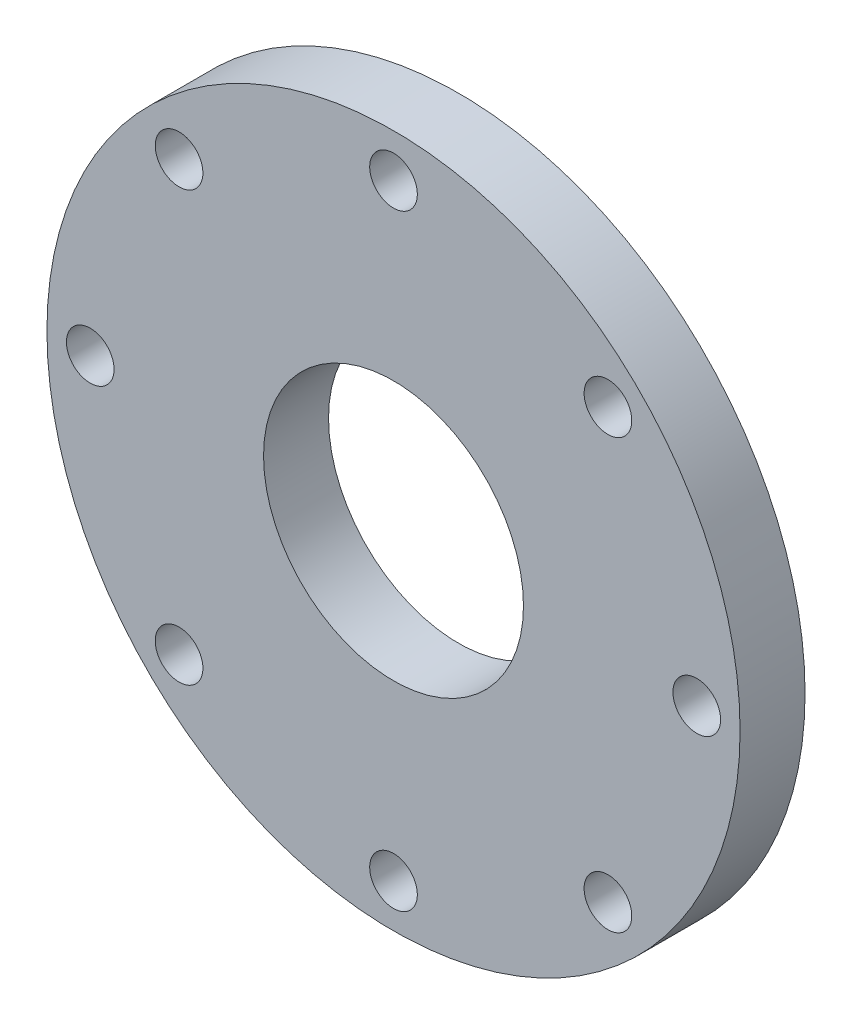
ISO-10303-21;
HEADER;
FILE_DESCRIPTION(('STEP AP214'),'2;1');
FILE_NAME('part.step','',(''),(''),'','','');
FILE_SCHEMA(('AUTOMOTIVE_DESIGN { 1 0 10303 214 1 1 1 1 }'));
ENDSEC;
DATA;
#1=APPLICATION_CONTEXT('core data for automotive mechanical design processes');
#2=APPLICATION_PROTOCOL_DEFINITION('international standard','automotive_design',2000,#1);
#3=PRODUCT_CONTEXT('',#1,'mechanical');
#4=PRODUCT('Part','Part','',(#3));
#5=PRODUCT_RELATED_PRODUCT_CATEGORY('part','',(#4));
#6=PRODUCT_DEFINITION_FORMATION('','',#4);
#7=PRODUCT_DEFINITION_CONTEXT('part definition',#1,'design');
#8=PRODUCT_DEFINITION('design','',#6,#7);
#9=PRODUCT_DEFINITION_SHAPE('','',#8);
#10=(LENGTH_UNIT() NAMED_UNIT(*) SI_UNIT(.MILLI.,.METRE.));
#11=(NAMED_UNIT(*) PLANE_ANGLE_UNIT() SI_UNIT($,.RADIAN.));
#12=(NAMED_UNIT(*) SI_UNIT($,.STERADIAN.) SOLID_ANGLE_UNIT());
#13=UNCERTAINTY_MEASURE_WITH_UNIT(LENGTH_MEASURE(1.E-05),#10,'distance_accuracy_value','');
#14=(GEOMETRIC_REPRESENTATION_CONTEXT(3) GLOBAL_UNCERTAINTY_ASSIGNED_CONTEXT((#13)) GLOBAL_UNIT_ASSIGNED_CONTEXT((#10,
#11,#12)) REPRESENTATION_CONTEXT('',''));
#15=CARTESIAN_POINT('',(0.,0.,0.));
#16=DIRECTION('',(0.,0.,1.));
#17=DIRECTION('',(1.,0.,0.));
#18=AXIS2_PLACEMENT_3D('',#15,#16,#17);
#19=CARTESIAN_POINT('',(49.497474683058,49.497474683058,0.));
#20=DIRECTION('',(0.,0.,-1.));
#21=DIRECTION('',(0.707106781186548,0.707106781186548,0.));
#22=AXIS2_PLACEMENT_3D('',#19,#20,#21);
#23=CYLINDRICAL_SURFACE('',#22,5.5);
#24=DIRECTION('',(0.,0.,1.));
#25=VECTOR('',#24,1.);
#26=CARTESIAN_POINT('',(53.386561979584,53.386561979584,0.));
#27=LINE('',#26,#25);
#28=CARTESIAN_POINT('',(53.386561979584,53.386561979584,0.));
#29=VERTEX_POINT('',#28);
#30=CARTESIAN_POINT('',(53.386561979584,53.386561979584,15.));
#31=VERTEX_POINT('',#30);
#32=EDGE_CURVE('E10',#29,#31,#27,.T.);
#33=ORIENTED_EDGE('',*,*,#32,.F.);
#34=CARTESIAN_POINT('',(49.497474683058,49.497474683058,0.));
#35=DIRECTION('',(0.,0.,1.));
#36=DIRECTION('',(0.707106781186548,0.707106781186548,0.));
#37=AXIS2_PLACEMENT_3D('',#34,#35,#36);
#38=CIRCLE('',#37,5.5);
#39=EDGE_CURVE('E199',#29,#29,#38,.T.);
#40=ORIENTED_EDGE('',*,*,#39,.F.);
#41=ORIENTED_EDGE('',*,*,#32,.T.);
#42=CARTESIAN_POINT('',(49.497474683058,49.497474683058,15.));
#43=DIRECTION('',(0.,0.,-1.));
#44=DIRECTION('',(0.707106781186548,0.707106781186548,0.));
#45=AXIS2_PLACEMENT_3D('',#42,#43,#44);
#46=CIRCLE('',#45,5.5);
#47=EDGE_CURVE('E182',#31,#31,#46,.T.);
#48=ORIENTED_EDGE('',*,*,#47,.F.);
#49=EDGE_LOOP('',(#33,#40,#41,#48));
#50=FACE_BOUND('',#49,.T.);
#51=ADVANCED_FACE('F16',(#50),#23,.F.);
#52=CARTESIAN_POINT('',(0.,70.,0.));
#53=DIRECTION('',(0.,0.,-1.));
#54=DIRECTION('',(0.,1.,0.));
#55=AXIS2_PLACEMENT_3D('',#52,#53,#54);
#56=CYLINDRICAL_SURFACE('',#55,5.5);
#57=DIRECTION('',(0.,0.,1.));
#58=VECTOR('',#57,1.);
#59=CARTESIAN_POINT('',(0.,75.5,0.));
#60=LINE('',#59,#58);
#61=CARTESIAN_POINT('',(0.,75.5,0.));
#62=VERTEX_POINT('',#61);
#63=CARTESIAN_POINT('',(0.,75.5,15.));
#64=VERTEX_POINT('',#63);
#65=EDGE_CURVE('E25',#62,#64,#60,.T.);
#66=ORIENTED_EDGE('',*,*,#65,.F.);
#67=CARTESIAN_POINT('',(0.,70.,0.));
#68=DIRECTION('',(0.,0.,1.));
#69=DIRECTION('',(0.,1.,0.));
#70=AXIS2_PLACEMENT_3D('',#67,#68,#69);
#71=CIRCLE('',#70,5.5);
#72=EDGE_CURVE('E212',#62,#62,#71,.T.);
#73=ORIENTED_EDGE('',*,*,#72,.F.);
#74=ORIENTED_EDGE('',*,*,#65,.T.);
#75=CARTESIAN_POINT('',(0.,70.,15.));
#76=DIRECTION('',(0.,0.,-1.));
#77=DIRECTION('',(0.,1.,0.));
#78=AXIS2_PLACEMENT_3D('',#75,#76,#77);
#79=CIRCLE('',#78,5.5);
#80=EDGE_CURVE('E162',#64,#64,#79,.T.);
#81=ORIENTED_EDGE('',*,*,#80,.F.);
#82=EDGE_LOOP('',(#66,#73,#74,#81));
#83=FACE_BOUND('',#82,.T.);
#84=ADVANCED_FACE('F231',(#83),#56,.F.);
#85=CARTESIAN_POINT('',(70.,0.,0.));
#86=DIRECTION('',(0.,0.,-1.));
#87=DIRECTION('',(1.,0.,0.));
#88=AXIS2_PLACEMENT_3D('',#85,#86,#87);
#89=CYLINDRICAL_SURFACE('',#88,5.5);
#90=DIRECTION('',(0.,0.,1.));
#91=VECTOR('',#90,1.);
#92=CARTESIAN_POINT('',(75.5,0.,0.));
#93=LINE('',#92,#91);
#94=CARTESIAN_POINT('',(75.5,0.,0.));
#95=VERTEX_POINT('',#94);
#96=CARTESIAN_POINT('',(75.5,0.,15.));
#97=VERTEX_POINT('',#96);
#98=EDGE_CURVE('E227',#95,#97,#93,.T.);
#99=ORIENTED_EDGE('',*,*,#98,.F.);
#100=CARTESIAN_POINT('',(70.,0.,0.));
#101=DIRECTION('',(0.,0.,1.));
#102=DIRECTION('',(1.,0.,0.));
#103=AXIS2_PLACEMENT_3D('',#100,#101,#102);
#104=CIRCLE('',#103,5.5);
#105=EDGE_CURVE('E198',#95,#95,#104,.T.);
#106=ORIENTED_EDGE('',*,*,#105,.F.);
#107=ORIENTED_EDGE('',*,*,#98,.T.);
#108=CARTESIAN_POINT('',(70.,0.,15.));
#109=DIRECTION('',(0.,0.,-1.));
#110=DIRECTION('',(1.,0.,0.));
#111=AXIS2_PLACEMENT_3D('',#108,#109,#110);
#112=CIRCLE('',#111,5.5);
#113=EDGE_CURVE('E158',#97,#97,#112,.T.);
#114=ORIENTED_EDGE('',*,*,#113,.F.);
#115=EDGE_LOOP('',(#99,#106,#107,#114));
#116=FACE_BOUND('',#115,.T.);
#117=ADVANCED_FACE('F277',(#116),#89,.F.);
#118=CARTESIAN_POINT('',(0.,0.,0.));
#119=DIRECTION('',(0.,0.,-1.));
#120=DIRECTION('',(1.,0.,0.));
#121=AXIS2_PLACEMENT_3D('',#118,#119,#120);
#122=CYLINDRICAL_SURFACE('',#121,30.);
#123=DIRECTION('',(0.,0.,1.));
#124=VECTOR('',#123,1.);
#125=CARTESIAN_POINT('',(30.,0.,0.));
#126=LINE('',#125,#124);
#127=CARTESIAN_POINT('',(30.,0.,0.));
#128=VERTEX_POINT('',#127);
#129=CARTESIAN_POINT('',(30.,0.,15.));
#130=VERTEX_POINT('',#129);
#131=EDGE_CURVE('E107',#128,#130,#126,.T.);
#132=ORIENTED_EDGE('',*,*,#131,.F.);
#133=CARTESIAN_POINT('',(0.,0.,0.));
#134=DIRECTION('',(0.,0.,1.));
#135=DIRECTION('',(1.,0.,0.));
#136=AXIS2_PLACEMENT_3D('',#133,#134,#135);
#137=CIRCLE('',#136,30.);
#138=EDGE_CURVE('E202',#128,#128,#137,.T.);
#139=ORIENTED_EDGE('',*,*,#138,.F.);
#140=ORIENTED_EDGE('',*,*,#131,.T.);
#141=CARTESIAN_POINT('',(0.,0.,15.));
#142=DIRECTION('',(0.,0.,-1.));
#143=DIRECTION('',(1.,0.,0.));
#144=AXIS2_PLACEMENT_3D('',#141,#142,#143);
#145=CIRCLE('',#144,30.);
#146=EDGE_CURVE('E163',#130,#130,#145,.T.);
#147=ORIENTED_EDGE('',*,*,#146,.F.);
#148=EDGE_LOOP('',(#132,#139,#140,#147));
#149=FACE_BOUND('',#148,.T.);
#150=ADVANCED_FACE('F18',(#149),#122,.F.);
#151=CARTESIAN_POINT('',(-49.49747468305,49.497474683058,0.));
#152=DIRECTION('',(0.,0.,-1.));
#153=DIRECTION('',(-0.707106781186548,0.707106781186548,0.));
#154=AXIS2_PLACEMENT_3D('',#151,#152,#153);
#155=CYLINDRICAL_SURFACE('',#154,5.5);
#156=DIRECTION('',(0.,0.,1.));
#157=VECTOR('',#156,1.);
#158=CARTESIAN_POINT('',(-53.38656197958,53.386561979584,0.));
#159=LINE('',#158,#157);
#160=CARTESIAN_POINT('',(-53.38656197958,53.386561979584,0.));
#161=VERTEX_POINT('',#160);
#162=CARTESIAN_POINT('',(-53.38656197958,53.386561979584,15.));
#163=VERTEX_POINT('',#162);
#164=EDGE_CURVE('E37',#161,#163,#159,.T.);
#165=ORIENTED_EDGE('',*,*,#164,.F.);
#166=CARTESIAN_POINT('',(-49.49747468305,49.497474683058,0.));
#167=DIRECTION('',(0.,0.,1.));
#168=DIRECTION('',(-0.707106781186548,0.707106781186548,0.));
#169=AXIS2_PLACEMENT_3D('',#166,#167,#168);
#170=CIRCLE('',#169,5.5);
#171=EDGE_CURVE('E217',#161,#161,#170,.T.);
#172=ORIENTED_EDGE('',*,*,#171,.F.);
#173=ORIENTED_EDGE('',*,*,#164,.T.);
#174=CARTESIAN_POINT('',(-49.49747468305,49.497474683058,15.));
#175=DIRECTION('',(0.,0.,-1.));
#176=DIRECTION('',(-0.707106781186548,0.707106781186548,0.));
#177=AXIS2_PLACEMENT_3D('',#174,#175,#176);
#178=CIRCLE('',#177,5.5);
#179=EDGE_CURVE('E172',#163,#163,#178,.T.);
#180=ORIENTED_EDGE('',*,*,#179,.F.);
#181=EDGE_LOOP('',(#165,#172,#173,#180));
#182=FACE_BOUND('',#181,.T.);
#183=ADVANCED_FACE('F285',(#182),#155,.F.);
#184=CARTESIAN_POINT('',(-70.,0.,0.));
#185=DIRECTION('',(0.,0.,-1.));
#186=DIRECTION('',(-1.,0.,0.));
#187=AXIS2_PLACEMENT_3D('',#184,#185,#186);
#188=CYLINDRICAL_SURFACE('',#187,5.5);
#189=DIRECTION('',(0.,0.,1.));
#190=VECTOR('',#189,1.);
#191=CARTESIAN_POINT('',(-75.5,0.,0.));
#192=LINE('',#191,#190);
#193=CARTESIAN_POINT('',(-75.5,0.,0.));
#194=VERTEX_POINT('',#193);
#195=CARTESIAN_POINT('',(-75.5,0.,15.));
#196=VERTEX_POINT('',#195);
#197=EDGE_CURVE('E154',#194,#196,#192,.T.);
#198=ORIENTED_EDGE('',*,*,#197,.F.);
#199=CARTESIAN_POINT('',(-70.,0.,0.));
#200=DIRECTION('',(0.,0.,1.));
#201=DIRECTION('',(-1.,0.,0.));
#202=AXIS2_PLACEMENT_3D('',#199,#200,#201);
#203=CIRCLE('',#202,5.5);
#204=EDGE_CURVE('E208',#194,#194,#203,.T.);
#205=ORIENTED_EDGE('',*,*,#204,.F.);
#206=ORIENTED_EDGE('',*,*,#197,.T.);
#207=CARTESIAN_POINT('',(-70.,0.,15.));
#208=DIRECTION('',(0.,0.,-1.));
#209=DIRECTION('',(-1.,0.,0.));
#210=AXIS2_PLACEMENT_3D('',#207,#208,#209);
#211=CIRCLE('',#210,5.5);
#212=EDGE_CURVE('E168',#196,#196,#211,.T.);
#213=ORIENTED_EDGE('',*,*,#212,.F.);
#214=EDGE_LOOP('',(#198,#205,#206,#213));
#215=FACE_BOUND('',#214,.T.);
#216=ADVANCED_FACE('F296',(#215),#188,.F.);
#217=CARTESIAN_POINT('',(49.497474683058,-49.49747468305,0.));
#218=DIRECTION('',(0.,0.,-1.));
#219=DIRECTION('',(0.707106781186548,-0.707106781186548,0.));
#220=AXIS2_PLACEMENT_3D('',#217,#218,#219);
#221=CYLINDRICAL_SURFACE('',#220,5.5);
#222=DIRECTION('',(0.,0.,1.));
#223=VECTOR('',#222,1.);
#224=CARTESIAN_POINT('',(53.386561979584,-53.38656197958,0.));
#225=LINE('',#224,#223);
#226=CARTESIAN_POINT('',(53.386561979584,-53.38656197958,0.));
#227=VERTEX_POINT('',#226);
#228=CARTESIAN_POINT('',(53.386561979584,-53.38656197958,15.));
#229=VERTEX_POINT('',#228);
#230=EDGE_CURVE('E157',#227,#229,#225,.T.);
#231=ORIENTED_EDGE('',*,*,#230,.F.);
#232=CARTESIAN_POINT('',(49.497474683058,-49.49747468305,0.));
#233=DIRECTION('',(0.,0.,1.));
#234=DIRECTION('',(0.707106781186548,-0.707106781186548,0.));
#235=AXIS2_PLACEMENT_3D('',#232,#233,#234);
#236=CIRCLE('',#235,5.5);
#237=EDGE_CURVE('E186',#227,#227,#236,.T.);
#238=ORIENTED_EDGE('',*,*,#237,.F.);
#239=ORIENTED_EDGE('',*,*,#230,.T.);
#240=CARTESIAN_POINT('',(49.497474683058,-49.49747468305,15.));
#241=DIRECTION('',(0.,0.,-1.));
#242=DIRECTION('',(0.707106781186548,-0.707106781186548,0.));
#243=AXIS2_PLACEMENT_3D('',#240,#241,#242);
#244=CIRCLE('',#243,5.5);
#245=EDGE_CURVE('E164',#229,#229,#244,.T.);
#246=ORIENTED_EDGE('',*,*,#245,.F.);
#247=EDGE_LOOP('',(#231,#238,#239,#246));
#248=FACE_BOUND('',#247,.T.);
#249=ADVANCED_FACE('F294',(#248),#221,.F.);
#250=CARTESIAN_POINT('',(0.,-70.,0.));
#251=DIRECTION('',(0.,0.,-1.));
#252=DIRECTION('',(0.,-1.,0.));
#253=AXIS2_PLACEMENT_3D('',#250,#251,#252);
#254=CYLINDRICAL_SURFACE('',#253,5.5);
#255=DIRECTION('',(0.,0.,1.));
#256=VECTOR('',#255,1.);
#257=CARTESIAN_POINT('',(0.,-75.5,0.));
#258=LINE('',#257,#256);
#259=CARTESIAN_POINT('',(0.,-75.5,0.));
#260=VERTEX_POINT('',#259);
#261=CARTESIAN_POINT('',(0.,-75.5,15.));
#262=VERTEX_POINT('',#261);
#263=EDGE_CURVE('E222',#260,#262,#258,.T.);
#264=ORIENTED_EDGE('',*,*,#263,.F.);
#265=CARTESIAN_POINT('',(0.,-70.,0.));
#266=DIRECTION('',(0.,0.,1.));
#267=DIRECTION('',(0.,-1.,0.));
#268=AXIS2_PLACEMENT_3D('',#265,#266,#267);
#269=CIRCLE('',#268,5.5);
#270=EDGE_CURVE('E187',#260,#260,#269,.T.);
#271=ORIENTED_EDGE('',*,*,#270,.F.);
#272=ORIENTED_EDGE('',*,*,#263,.T.);
#273=CARTESIAN_POINT('',(0.,-70.,15.));
#274=DIRECTION('',(0.,0.,-1.));
#275=DIRECTION('',(0.,-1.,0.));
#276=AXIS2_PLACEMENT_3D('',#273,#274,#275);
#277=CIRCLE('',#276,5.5);
#278=EDGE_CURVE('E147',#262,#262,#277,.T.);
#279=ORIENTED_EDGE('',*,*,#278,.F.);
#280=EDGE_LOOP('',(#264,#271,#272,#279));
#281=FACE_BOUND('',#280,.T.);
#282=ADVANCED_FACE('F303',(#281),#254,.F.);
#283=CARTESIAN_POINT('',(-49.49747468305,-49.49747468305,0.));
#284=DIRECTION('',(0.,0.,-1.));
#285=DIRECTION('',(-0.707106781186548,-0.707106781186548,0.));
#286=AXIS2_PLACEMENT_3D('',#283,#284,#285);
#287=CYLINDRICAL_SURFACE('',#286,5.5);
#288=DIRECTION('',(0.,0.,1.));
#289=VECTOR('',#288,1.);
#290=CARTESIAN_POINT('',(-53.38656197958,-53.38656197958,0.));
#291=LINE('',#290,#289);
#292=CARTESIAN_POINT('',(-53.38656197958,-53.38656197958,0.));
#293=VERTEX_POINT('',#292);
#294=CARTESIAN_POINT('',(-53.38656197958,-53.38656197958,15.));
#295=VERTEX_POINT('',#294);
#296=EDGE_CURVE('E128',#293,#295,#291,.T.);
#297=ORIENTED_EDGE('',*,*,#296,.F.);
#298=CARTESIAN_POINT('',(-49.49747468305,-49.49747468305,0.));
#299=DIRECTION('',(0.,0.,1.));
#300=DIRECTION('',(-0.707106781186548,-0.707106781186548,0.));
#301=AXIS2_PLACEMENT_3D('',#298,#299,#300);
#302=CIRCLE('',#301,5.5);
#303=EDGE_CURVE('E191',#293,#293,#302,.T.);
#304=ORIENTED_EDGE('',*,*,#303,.F.);
#305=ORIENTED_EDGE('',*,*,#296,.T.);
#306=CARTESIAN_POINT('',(-49.49747468305,-49.49747468305,15.));
#307=DIRECTION('',(0.,0.,-1.));
#308=DIRECTION('',(-0.707106781186548,-0.707106781186548,0.));
#309=AXIS2_PLACEMENT_3D('',#306,#307,#308);
#310=CIRCLE('',#309,5.5);
#311=EDGE_CURVE('E140',#295,#295,#310,.T.);
#312=ORIENTED_EDGE('',*,*,#311,.F.);
#313=EDGE_LOOP('',(#297,#304,#305,#312));
#314=FACE_BOUND('',#313,.T.);
#315=ADVANCED_FACE('F250',(#314),#287,.F.);
#316=CARTESIAN_POINT('',(0.,0.,0.));
#317=DIRECTION('',(0.,0.,1.));
#318=DIRECTION('',(1.,0.,0.));
#319=AXIS2_PLACEMENT_3D('',#316,#317,#318);
#320=PLANE('',#319);
#321=ORIENTED_EDGE('',*,*,#171,.T.);
#322=EDGE_LOOP('',(#321));
#323=FACE_BOUND('',#322,.T.);
#324=ORIENTED_EDGE('',*,*,#72,.T.);
#325=EDGE_LOOP('',(#324));
#326=FACE_BOUND('',#325,.T.);
#327=ORIENTED_EDGE('',*,*,#204,.T.);
#328=EDGE_LOOP('',(#327));
#329=FACE_BOUND('',#328,.T.);
#330=ORIENTED_EDGE('',*,*,#138,.T.);
#331=EDGE_LOOP('',(#330));
#332=FACE_BOUND('',#331,.T.);
#333=ORIENTED_EDGE('',*,*,#39,.T.);
#334=EDGE_LOOP('',(#333));
#335=FACE_BOUND('',#334,.T.);
#336=ORIENTED_EDGE('',*,*,#105,.T.);
#337=EDGE_LOOP('',(#336));
#338=FACE_BOUND('',#337,.T.);
#339=ORIENTED_EDGE('',*,*,#303,.T.);
#340=EDGE_LOOP('',(#339));
#341=FACE_BOUND('',#340,.T.);
#342=ORIENTED_EDGE('',*,*,#270,.T.);
#343=EDGE_LOOP('',(#342));
#344=FACE_BOUND('',#343,.T.);
#345=ORIENTED_EDGE('',*,*,#237,.T.);
#346=EDGE_LOOP('',(#345));
#347=FACE_BOUND('',#346,.T.);
#348=CARTESIAN_POINT('',(0.,0.,0.));
#349=DIRECTION('',(0.,0.,1.));
#350=DIRECTION('',(1.,0.,0.));
#351=AXIS2_PLACEMENT_3D('',#348,#349,#350);
#352=CIRCLE('',#351,80.);
#353=CARTESIAN_POINT('',(80.,0.,0.));
#354=VERTEX_POINT('',#353);
#355=EDGE_CURVE('E141',#354,#354,#352,.T.);
#356=ORIENTED_EDGE('',*,*,#355,.F.);
#357=EDGE_LOOP('',(#356));
#358=FACE_BOUND('',#357,.T.);
#359=ADVANCED_FACE('F236',(#323,#326,#329,#332,#335,#338,#341,#344,#347,#358),#320,.F.);
#360=CARTESIAN_POINT('',(0.,0.,15.));
#361=DIRECTION('',(0.,0.,1.));
#362=DIRECTION('',(1.,0.,0.));
#363=AXIS2_PLACEMENT_3D('',#360,#361,#362);
#364=PLANE('',#363);
#365=ORIENTED_EDGE('',*,*,#47,.T.);
#366=EDGE_LOOP('',(#365));
#367=FACE_BOUND('',#366,.T.);
#368=ORIENTED_EDGE('',*,*,#80,.T.);
#369=EDGE_LOOP('',(#368));
#370=FACE_BOUND('',#369,.T.);
#371=ORIENTED_EDGE('',*,*,#113,.T.);
#372=EDGE_LOOP('',(#371));
#373=FACE_BOUND('',#372,.T.);
#374=ORIENTED_EDGE('',*,*,#146,.T.);
#375=EDGE_LOOP('',(#374));
#376=FACE_BOUND('',#375,.T.);
#377=ORIENTED_EDGE('',*,*,#179,.T.);
#378=EDGE_LOOP('',(#377));
#379=FACE_BOUND('',#378,.T.);
#380=ORIENTED_EDGE('',*,*,#212,.T.);
#381=EDGE_LOOP('',(#380));
#382=FACE_BOUND('',#381,.T.);
#383=ORIENTED_EDGE('',*,*,#245,.T.);
#384=EDGE_LOOP('',(#383));
#385=FACE_BOUND('',#384,.T.);
#386=ORIENTED_EDGE('',*,*,#278,.T.);
#387=EDGE_LOOP('',(#386));
#388=FACE_BOUND('',#387,.T.);
#389=ORIENTED_EDGE('',*,*,#311,.T.);
#390=EDGE_LOOP('',(#389));
#391=FACE_BOUND('',#390,.T.);
#392=CARTESIAN_POINT('',(0.,0.,15.));
#393=DIRECTION('',(0.,0.,1.));
#394=DIRECTION('',(1.,0.,0.));
#395=AXIS2_PLACEMENT_3D('',#392,#393,#394);
#396=CIRCLE('',#395,80.);
#397=CARTESIAN_POINT('',(80.,0.,15.));
#398=VERTEX_POINT('',#397);
#399=EDGE_CURVE('E134',#398,#398,#396,.T.);
#400=ORIENTED_EDGE('',*,*,#399,.T.);
#401=EDGE_LOOP('',(#400));
#402=FACE_BOUND('',#401,.T.);
#403=ADVANCED_FACE('F135',(#367,#370,#373,#376,#379,#382,#385,#388,#391,#402),#364,.T.);
#404=CARTESIAN_POINT('',(0.,0.,0.));
#405=DIRECTION('',(0.,0.,1.));
#406=DIRECTION('',(1.,0.,0.));
#407=AXIS2_PLACEMENT_3D('',#404,#405,#406);
#408=CYLINDRICAL_SURFACE('',#407,80.);
#409=DIRECTION('',(0.,0.,1.));
#410=VECTOR('',#409,1.);
#411=CARTESIAN_POINT('',(80.,0.,0.));
#412=LINE('',#411,#410);
#413=EDGE_CURVE('E150',#354,#398,#412,.T.);
#414=ORIENTED_EDGE('',*,*,#413,.F.);
#415=ORIENTED_EDGE('',*,*,#355,.T.);
#416=ORIENTED_EDGE('',*,*,#413,.T.);
#417=ORIENTED_EDGE('',*,*,#399,.F.);
#418=EDGE_LOOP('',(#414,#415,#416,#417));
#419=FACE_BOUND('',#418,.T.);
#420=ADVANCED_FACE('F235',(#419),#408,.T.);
#421=CLOSED_SHELL('',(#51,#84,#117,#150,#183,#216,#249,#282,#315,#359,#403,#420));
#422=MANIFOLD_SOLID_BREP('B1',#421);
#423=ADVANCED_BREP_SHAPE_REPRESENTATION('',(#18,#422),#14);
#424=SHAPE_DEFINITION_REPRESENTATION(#9,#423);
ENDSEC;
END-ISO-10303-21;
